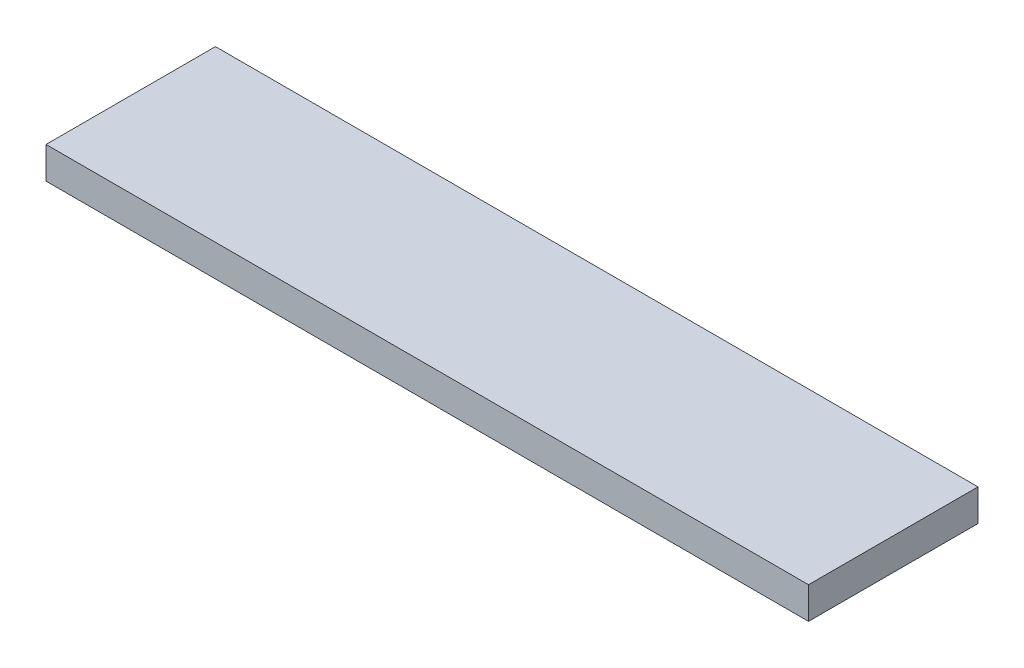
ISO-10303-21;
HEADER;
FILE_DESCRIPTION(('STEP AP214'),'2;1');
FILE_NAME('part.step','',(''),(''),'','','');
FILE_SCHEMA(('AUTOMOTIVE_DESIGN { 1 0 10303 214 1 1 1 1 }'));
ENDSEC;
DATA;
#1=APPLICATION_CONTEXT('core data for automotive mechanical design processes');
#2=APPLICATION_PROTOCOL_DEFINITION('international standard','automotive_design',2000,#1);
#3=PRODUCT_CONTEXT('',#1,'mechanical');
#4=PRODUCT('Part','Part','',(#3));
#5=PRODUCT_RELATED_PRODUCT_CATEGORY('part','',(#4));
#6=PRODUCT_DEFINITION_FORMATION('','',#4);
#7=PRODUCT_DEFINITION_CONTEXT('part definition',#1,'design');
#8=PRODUCT_DEFINITION('design','',#6,#7);
#9=PRODUCT_DEFINITION_SHAPE('','',#8);
#10=(LENGTH_UNIT() NAMED_UNIT(*) SI_UNIT(.MILLI.,.METRE.));
#11=(NAMED_UNIT(*) PLANE_ANGLE_UNIT() SI_UNIT($,.RADIAN.));
#12=(NAMED_UNIT(*) SI_UNIT($,.STERADIAN.) SOLID_ANGLE_UNIT());
#13=UNCERTAINTY_MEASURE_WITH_UNIT(LENGTH_MEASURE(1.E-05),#10,'distance_accuracy_value','');
#14=(GEOMETRIC_REPRESENTATION_CONTEXT(3) GLOBAL_UNCERTAINTY_ASSIGNED_CONTEXT((#13)) GLOBAL_UNIT_ASSIGNED_CONTEXT((#10,
#11,#12)) REPRESENTATION_CONTEXT('',''));
#15=CARTESIAN_POINT('',(0.,0.,0.));
#16=DIRECTION('',(0.,0.,1.));
#17=DIRECTION('',(1.,0.,0.));
#18=AXIS2_PLACEMENT_3D('',#15,#16,#17);
#19=CARTESIAN_POINT('',(-61.9125,-15.875,25.4));
#20=DIRECTION('',(1.,0.,0.));
#21=DIRECTION('',(0.,0.,-1.));
#22=AXIS2_PLACEMENT_3D('',#19,#20,#21);
#23=PLANE('',#22);
#24=DIRECTION('',(0.,-1.,0.));
#25=VECTOR('',#24,1.);
#26=CARTESIAN_POINT('',(-61.9125,-15.875,0.));
#27=LINE('',#26,#25);
#28=CARTESIAN_POINT('',(-61.9125,-11.1125,0.));
#29=VERTEX_POINT('',#28);
#30=CARTESIAN_POINT('',(-61.9125,-15.875,0.));
#31=VERTEX_POINT('',#30);
#32=EDGE_CURVE('E98',#29,#31,#27,.T.);
#33=ORIENTED_EDGE('',*,*,#32,.T.);
#34=DIRECTION('',(0.,0.,-1.));
#35=VECTOR('',#34,1.);
#36=CARTESIAN_POINT('',(-61.9125,-15.875,25.4));
#37=LINE('',#36,#35);
#38=CARTESIAN_POINT('',(-61.9125,-15.875,25.4));
#39=VERTEX_POINT('',#38);
#40=EDGE_CURVE('E11',#39,#31,#37,.T.);
#41=ORIENTED_EDGE('',*,*,#40,.F.);
#42=DIRECTION('',(0.,-1.,0.));
#43=VECTOR('',#42,1.);
#44=CARTESIAN_POINT('',(-61.9125,-15.875,25.4));
#45=LINE('',#44,#43);
#46=CARTESIAN_POINT('',(-61.9125,-11.1125,25.4));
#47=VERTEX_POINT('',#46);
#48=EDGE_CURVE('E86',#47,#39,#45,.T.);
#49=ORIENTED_EDGE('',*,*,#48,.F.);
#50=DIRECTION('',(0.,0.,-1.));
#51=VECTOR('',#50,1.);
#52=CARTESIAN_POINT('',(-61.9125,-11.1125,25.4));
#53=LINE('',#52,#51);
#54=EDGE_CURVE('E94',#47,#29,#53,.T.);
#55=ORIENTED_EDGE('',*,*,#54,.T.);
#56=EDGE_LOOP('',(#33,#41,#49,#55));
#57=FACE_BOUND('',#56,.T.);
#58=ADVANCED_FACE('F35',(#57),#23,.F.);
#59=CARTESIAN_POINT('',(-61.9125,-15.875,25.4));
#60=DIRECTION('',(0.,1.,0.));
#61=DIRECTION('',(0.,0.,1.));
#62=AXIS2_PLACEMENT_3D('',#59,#60,#61);
#63=PLANE('',#62);
#64=DIRECTION('',(1.,0.,0.));
#65=VECTOR('',#64,1.);
#66=CARTESIAN_POINT('',(-61.9125,-15.875,0.));
#67=LINE('',#66,#65);
#68=CARTESIAN_POINT('',(52.3875,-15.875,0.));
#69=VERTEX_POINT('',#68);
#70=EDGE_CURVE('E90',#31,#69,#67,.T.);
#71=ORIENTED_EDGE('',*,*,#70,.T.);
#72=DIRECTION('',(0.,0.,-1.));
#73=VECTOR('',#72,1.);
#74=CARTESIAN_POINT('',(52.3875,-15.875,25.4));
#75=LINE('',#74,#73);
#76=CARTESIAN_POINT('',(52.3875,-15.875,25.4));
#77=VERTEX_POINT('',#76);
#78=EDGE_CURVE('E43',#77,#69,#75,.T.);
#79=ORIENTED_EDGE('',*,*,#78,.F.);
#80=DIRECTION('',(1.,0.,0.));
#81=VECTOR('',#80,1.);
#82=CARTESIAN_POINT('',(-61.9125,-15.875,25.4));
#83=LINE('',#82,#81);
#84=EDGE_CURVE('E81',#39,#77,#83,.T.);
#85=ORIENTED_EDGE('',*,*,#84,.F.);
#86=ORIENTED_EDGE('',*,*,#40,.T.);
#87=EDGE_LOOP('',(#71,#79,#85,#86));
#88=FACE_BOUND('',#87,.T.);
#89=ADVANCED_FACE('F89',(#88),#63,.F.);
#90=CARTESIAN_POINT('',(52.3875,-15.875,25.4));
#91=DIRECTION('',(-1.,0.,0.));
#92=DIRECTION('',(0.,0.,1.));
#93=AXIS2_PLACEMENT_3D('',#90,#91,#92);
#94=PLANE('',#93);
#95=DIRECTION('',(0.,1.,0.));
#96=VECTOR('',#95,1.);
#97=CARTESIAN_POINT('',(52.3875,-15.875,0.));
#98=LINE('',#97,#96);
#99=CARTESIAN_POINT('',(52.3875,-11.1125,0.));
#100=VERTEX_POINT('',#99);
#101=EDGE_CURVE('E68',#69,#100,#98,.T.);
#102=ORIENTED_EDGE('',*,*,#101,.T.);
#103=DIRECTION('',(0.,0.,-1.));
#104=VECTOR('',#103,1.);
#105=CARTESIAN_POINT('',(52.3875,-11.1125,25.4));
#106=LINE('',#105,#104);
#107=CARTESIAN_POINT('',(52.3875,-11.1125,25.4));
#108=VERTEX_POINT('',#107);
#109=EDGE_CURVE('E91',#108,#100,#106,.T.);
#110=ORIENTED_EDGE('',*,*,#109,.F.);
#111=DIRECTION('',(0.,1.,0.));
#112=VECTOR('',#111,1.);
#113=CARTESIAN_POINT('',(52.3875,-15.875,25.4));
#114=LINE('',#113,#112);
#115=EDGE_CURVE('E84',#77,#108,#114,.T.);
#116=ORIENTED_EDGE('',*,*,#115,.F.);
#117=ORIENTED_EDGE('',*,*,#78,.T.);
#118=EDGE_LOOP('',(#102,#110,#116,#117));
#119=FACE_BOUND('',#118,.T.);
#120=ADVANCED_FACE('F92',(#119),#94,.F.);
#121=CARTESIAN_POINT('',(-61.9125,-11.1125,25.4));
#122=DIRECTION('',(0.,-1.,0.));
#123=DIRECTION('',(0.,0.,-1.));
#124=AXIS2_PLACEMENT_3D('',#121,#122,#123);
#125=PLANE('',#124);
#126=DIRECTION('',(-1.,0.,0.));
#127=VECTOR('',#126,1.);
#128=CARTESIAN_POINT('',(-61.9125,-11.1125,0.));
#129=LINE('',#128,#127);
#130=EDGE_CURVE('E74',#100,#29,#129,.T.);
#131=ORIENTED_EDGE('',*,*,#130,.T.);
#132=ORIENTED_EDGE('',*,*,#54,.F.);
#133=DIRECTION('',(-1.,0.,0.));
#134=VECTOR('',#133,1.);
#135=CARTESIAN_POINT('',(-61.9125,-11.1125,25.4));
#136=LINE('',#135,#134);
#137=EDGE_CURVE('E51',#108,#47,#136,.T.);
#138=ORIENTED_EDGE('',*,*,#137,.F.);
#139=ORIENTED_EDGE('',*,*,#109,.T.);
#140=EDGE_LOOP('',(#131,#132,#138,#139));
#141=FACE_BOUND('',#140,.T.);
#142=ADVANCED_FACE('F105',(#141),#125,.F.);
#143=CARTESIAN_POINT('',(0.,0.,25.4));
#144=DIRECTION('',(0.,0.,-1.));
#145=DIRECTION('',(-1.,0.,0.));
#146=AXIS2_PLACEMENT_3D('',#143,#144,#145);
#147=PLANE('',#146);
#148=ORIENTED_EDGE('',*,*,#48,.T.);
#149=ORIENTED_EDGE('',*,*,#84,.T.);
#150=ORIENTED_EDGE('',*,*,#115,.T.);
#151=ORIENTED_EDGE('',*,*,#137,.T.);
#152=EDGE_LOOP('',(#148,#149,#150,#151));
#153=FACE_BOUND('',#152,.T.);
#154=ADVANCED_FACE('F82',(#153),#147,.F.);
#155=CARTESIAN_POINT('',(0.,0.,0.));
#156=DIRECTION('',(0.,0.,-1.));
#157=DIRECTION('',(-1.,0.,0.));
#158=AXIS2_PLACEMENT_3D('',#155,#156,#157);
#159=PLANE('',#158);
#160=ORIENTED_EDGE('',*,*,#32,.F.);
#161=ORIENTED_EDGE('',*,*,#130,.F.);
#162=ORIENTED_EDGE('',*,*,#101,.F.);
#163=ORIENTED_EDGE('',*,*,#70,.F.);
#164=EDGE_LOOP('',(#160,#161,#162,#163));
#165=FACE_BOUND('',#164,.T.);
#166=ADVANCED_FACE('F108',(#165),#159,.T.);
#167=CLOSED_SHELL('',(#58,#89,#120,#142,#154,#166));
#168=MANIFOLD_SOLID_BREP('B2',#167);
#169=ADVANCED_BREP_SHAPE_REPRESENTATION('',(#18,#168),#14);
#170=SHAPE_DEFINITION_REPRESENTATION(#9,#169);
ENDSEC;
END-ISO-10303-21;
